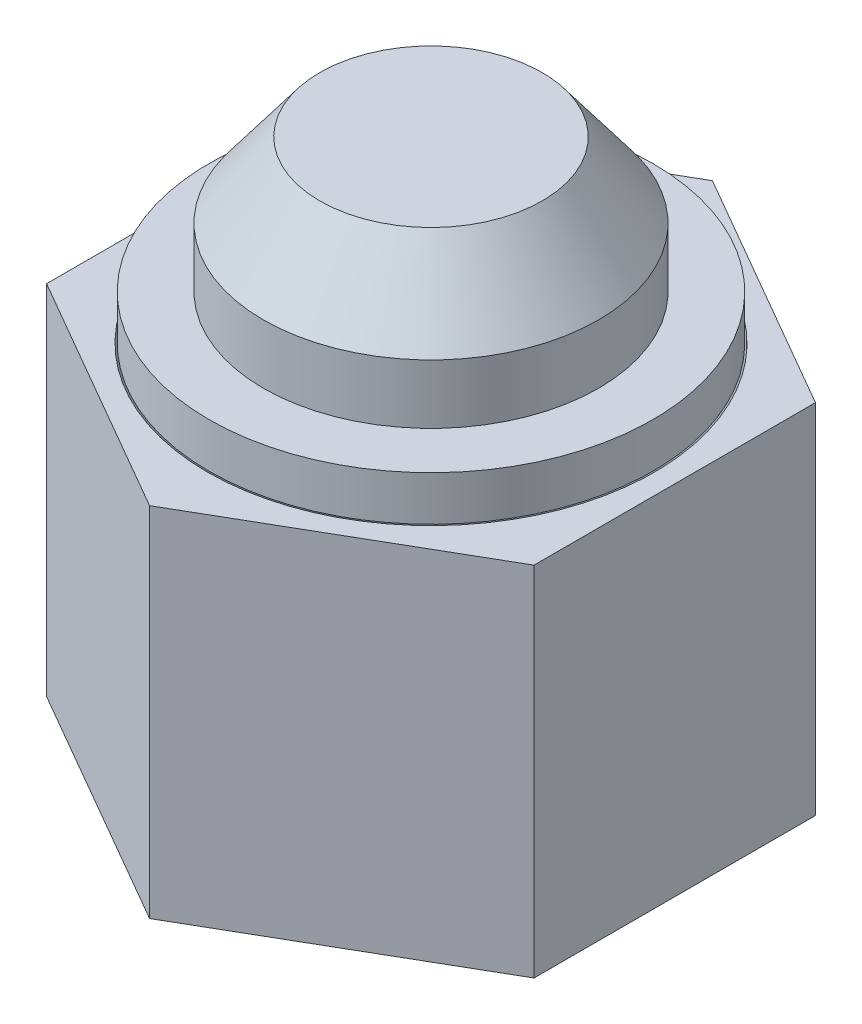
ISO-10303-21;
HEADER;
FILE_DESCRIPTION(('STEP AP214'),'2;1');
FILE_NAME('part.step','',(''),(''),'','','');
FILE_SCHEMA(('AUTOMOTIVE_DESIGN { 1 0 10303 214 1 1 1 1 }'));
ENDSEC;
DATA;
#1=APPLICATION_CONTEXT('core data for automotive mechanical design processes');
#2=APPLICATION_PROTOCOL_DEFINITION('international standard','automotive_design',2000,#1);
#3=PRODUCT_CONTEXT('',#1,'mechanical');
#4=PRODUCT('Part','Part','',(#3));
#5=PRODUCT_RELATED_PRODUCT_CATEGORY('part','',(#4));
#6=PRODUCT_DEFINITION_FORMATION('','',#4);
#7=PRODUCT_DEFINITION_CONTEXT('part definition',#1,'design');
#8=PRODUCT_DEFINITION('design','',#6,#7);
#9=PRODUCT_DEFINITION_SHAPE('','',#8);
#10=(LENGTH_UNIT() NAMED_UNIT(*) SI_UNIT(.MILLI.,.METRE.));
#11=(NAMED_UNIT(*) PLANE_ANGLE_UNIT() SI_UNIT($,.RADIAN.));
#12=(NAMED_UNIT(*) SI_UNIT($,.STERADIAN.) SOLID_ANGLE_UNIT());
#13=UNCERTAINTY_MEASURE_WITH_UNIT(LENGTH_MEASURE(1.E-05),#10,'distance_accuracy_value','');
#14=(GEOMETRIC_REPRESENTATION_CONTEXT(3) GLOBAL_UNCERTAINTY_ASSIGNED_CONTEXT((#13)) GLOBAL_UNIT_ASSIGNED_CONTEXT((#10,
#11,#12)) REPRESENTATION_CONTEXT('',''));
#15=CARTESIAN_POINT('',(0.,0.,0.));
#16=DIRECTION('',(0.,0.,1.));
#17=DIRECTION('',(1.,0.,0.));
#18=AXIS2_PLACEMENT_3D('',#15,#16,#17);
#19=CARTESIAN_POINT('',(6.92548806124741,-10.16,0.));
#20=DIRECTION('',(1.,0.,0.));
#21=DIRECTION('',(0.,0.,-1.));
#22=AXIS2_PLACEMENT_3D('',#19,#20,#21);
#23=PLANE('',#22);
#24=DIRECTION('',(0.,0.,-1.));
#25=VECTOR('',#24,1.);
#26=CARTESIAN_POINT('',(6.92548806124741,0.,0.));
#27=LINE('',#26,#25);
#28=CARTESIAN_POINT('',(6.92548806124746,0.,3.99843239643067));
#29=VERTEX_POINT('',#28);
#30=CARTESIAN_POINT('',(6.92548806124737,0.,-3.99843239643082));
#31=VERTEX_POINT('',#30);
#32=EDGE_CURVE('E153',#29,#31,#27,.T.);
#33=ORIENTED_EDGE('',*,*,#32,.F.);
#34=DIRECTION('',(0.,1.,0.));
#35=VECTOR('',#34,1.);
#36=CARTESIAN_POINT('',(6.92548806124746,-10.16,3.99843239643067));
#37=LINE('',#36,#35);
#38=CARTESIAN_POINT('',(6.92548806124746,-10.16,3.99843239643067));
#39=VERTEX_POINT('',#38);
#40=EDGE_CURVE('E12',#39,#29,#37,.T.);
#41=ORIENTED_EDGE('',*,*,#40,.F.);
#42=DIRECTION('',(0.,0.,-1.));
#43=VECTOR('',#42,1.);
#44=CARTESIAN_POINT('',(6.92548806124741,-10.16,0.));
#45=LINE('',#44,#43);
#46=CARTESIAN_POINT('',(6.92548806124737,-10.16,-3.99843239643082));
#47=VERTEX_POINT('',#46);
#48=EDGE_CURVE('E182',#39,#47,#45,.T.);
#49=ORIENTED_EDGE('',*,*,#48,.T.);
#50=DIRECTION('',(0.,1.,0.));
#51=VECTOR('',#50,1.);
#52=CARTESIAN_POINT('',(6.92548806124737,-10.16,-3.99843239643082));
#53=LINE('',#52,#51);
#54=EDGE_CURVE('E61',#47,#31,#53,.T.);
#55=ORIENTED_EDGE('',*,*,#54,.T.);
#56=EDGE_LOOP('',(#33,#41,#49,#55));
#57=FACE_BOUND('',#56,.T.);
#58=ADVANCED_FACE('F57',(#57),#23,.T.);
#59=CARTESIAN_POINT('',(3.46274403062375,-10.16,5.99764859464607));
#60=DIRECTION('',(0.500000000000007,0.,0.866025403784434));
#61=DIRECTION('',(0.866025403784435,0.,-0.500000000000007));
#62=AXIS2_PLACEMENT_3D('',#59,#60,#61);
#63=PLANE('',#62);
#64=DIRECTION('',(0.866025403784435,0.,-0.500000000000007));
#65=VECTOR('',#64,1.);
#66=CARTESIAN_POINT('',(3.46274403062375,0.,5.99764859464607));
#67=LINE('',#66,#65);
#68=CARTESIAN_POINT('',(0.,0.,7.99686479286147));
#69=VERTEX_POINT('',#68);
#70=EDGE_CURVE('E170',#69,#29,#67,.T.);
#71=ORIENTED_EDGE('',*,*,#70,.F.);
#72=DIRECTION('',(0.,1.,0.));
#73=VECTOR('',#72,1.);
#74=CARTESIAN_POINT('',(0.,-10.16,7.99686479286147));
#75=LINE('',#74,#73);
#76=CARTESIAN_POINT('',(0.,-10.16,7.99686479286147));
#77=VERTEX_POINT('',#76);
#78=EDGE_CURVE('E68',#77,#69,#75,.T.);
#79=ORIENTED_EDGE('',*,*,#78,.F.);
#80=DIRECTION('',(0.866025403784435,0.,-0.500000000000007));
#81=VECTOR('',#80,1.);
#82=CARTESIAN_POINT('',(3.46274403062375,-10.16,5.99764859464607));
#83=LINE('',#82,#81);
#84=EDGE_CURVE('E135',#77,#39,#83,.T.);
#85=ORIENTED_EDGE('',*,*,#84,.T.);
#86=ORIENTED_EDGE('',*,*,#40,.T.);
#87=EDGE_LOOP('',(#71,#79,#85,#86));
#88=FACE_BOUND('',#87,.T.);
#89=ADVANCED_FACE('F186',(#88),#63,.T.);
#90=CARTESIAN_POINT('',(-3.46274403062367,-10.16,5.99764859464612));
#91=DIRECTION('',(-0.499999999999995,0.,0.866025403784441));
#92=DIRECTION('',(0.866025403784442,0.,0.499999999999995));
#93=AXIS2_PLACEMENT_3D('',#90,#91,#92);
#94=PLANE('',#93);
#95=DIRECTION('',(0.866025403784442,0.,0.499999999999995));
#96=VECTOR('',#95,1.);
#97=CARTESIAN_POINT('',(-3.46274403062367,0.,5.99764859464612));
#98=LINE('',#97,#96);
#99=CARTESIAN_POINT('',(-6.9254880612474,0.,3.99843239643077));
#100=VERTEX_POINT('',#99);
#101=EDGE_CURVE('E121',#100,#69,#98,.T.);
#102=ORIENTED_EDGE('',*,*,#101,.F.);
#103=DIRECTION('',(0.,1.,0.));
#104=VECTOR('',#103,1.);
#105=CARTESIAN_POINT('',(-6.9254880612474,-10.16,3.99843239643077));
#106=LINE('',#105,#104);
#107=CARTESIAN_POINT('',(-6.9254880612474,-10.16,3.99843239643077));
#108=VERTEX_POINT('',#107);
#109=EDGE_CURVE('E116',#108,#100,#106,.T.);
#110=ORIENTED_EDGE('',*,*,#109,.F.);
#111=DIRECTION('',(0.866025403784442,0.,0.499999999999995));
#112=VECTOR('',#111,1.);
#113=CARTESIAN_POINT('',(-3.46274403062367,-10.16,5.99764859464612));
#114=LINE('',#113,#112);
#115=EDGE_CURVE('E119',#108,#77,#114,.T.);
#116=ORIENTED_EDGE('',*,*,#115,.T.);
#117=ORIENTED_EDGE('',*,*,#78,.T.);
#118=EDGE_LOOP('',(#102,#110,#116,#117));
#119=FACE_BOUND('',#118,.T.);
#120=ADVANCED_FACE('F118',(#119),#94,.T.);
#121=CARTESIAN_POINT('',(-6.92548806124741,-10.16,0.));
#122=DIRECTION('',(-1.,0.,0.));
#123=DIRECTION('',(0.,0.,1.));
#124=AXIS2_PLACEMENT_3D('',#121,#122,#123);
#125=PLANE('',#124);
#126=DIRECTION('',(0.,0.,1.));
#127=VECTOR('',#126,1.);
#128=CARTESIAN_POINT('',(-6.92548806124741,0.,0.));
#129=LINE('',#128,#127);
#130=CARTESIAN_POINT('',(-6.92548806124743,0.,-3.99843239643072));
#131=VERTEX_POINT('',#130);
#132=EDGE_CURVE('E165',#131,#100,#129,.T.);
#133=ORIENTED_EDGE('',*,*,#132,.F.);
#134=DIRECTION('',(0.,1.,0.));
#135=VECTOR('',#134,1.);
#136=CARTESIAN_POINT('',(-6.92548806124743,-10.16,-3.99843239643072));
#137=LINE('',#136,#135);
#138=CARTESIAN_POINT('',(-6.92548806124743,-10.16,-3.99843239643072));
#139=VERTEX_POINT('',#138);
#140=EDGE_CURVE('E127',#139,#131,#137,.T.);
#141=ORIENTED_EDGE('',*,*,#140,.F.);
#142=DIRECTION('',(0.,0.,1.));
#143=VECTOR('',#142,1.);
#144=CARTESIAN_POINT('',(-6.92548806124741,-10.16,0.));
#145=LINE('',#144,#143);
#146=EDGE_CURVE('E133',#139,#108,#145,.T.);
#147=ORIENTED_EDGE('',*,*,#146,.T.);
#148=ORIENTED_EDGE('',*,*,#109,.T.);
#149=EDGE_LOOP('',(#133,#141,#147,#148));
#150=FACE_BOUND('',#149,.T.);
#151=ADVANCED_FACE('F138',(#150),#125,.T.);
#152=CARTESIAN_POINT('',(-3.46274403062371,-10.16,-5.9976485946461));
#153=DIRECTION('',(-0.500000000000001,0.,-0.866025403784438));
#154=DIRECTION('',(-0.866025403784438,0.,0.500000000000001));
#155=AXIS2_PLACEMENT_3D('',#152,#153,#154);
#156=PLANE('',#155);
#157=DIRECTION('',(-0.866025403784438,0.,0.500000000000001));
#158=VECTOR('',#157,1.);
#159=CARTESIAN_POINT('',(-3.46274403062371,0.,-5.9976485946461));
#160=LINE('',#159,#158);
#161=CARTESIAN_POINT('',(0.,0.,-7.99686479286147));
#162=VERTEX_POINT('',#161);
#163=EDGE_CURVE('E161',#162,#131,#160,.T.);
#164=ORIENTED_EDGE('',*,*,#163,.F.);
#165=DIRECTION('',(0.,1.,0.));
#166=VECTOR('',#165,1.);
#167=CARTESIAN_POINT('',(0.,-10.16,-7.99686479286147));
#168=LINE('',#167,#166);
#169=CARTESIAN_POINT('',(0.,-10.16,-7.99686479286147));
#170=VERTEX_POINT('',#169);
#171=EDGE_CURVE('E178',#170,#162,#168,.T.);
#172=ORIENTED_EDGE('',*,*,#171,.F.);
#173=DIRECTION('',(-0.866025403784438,0.,0.500000000000001));
#174=VECTOR('',#173,1.);
#175=CARTESIAN_POINT('',(-3.46274403062371,-10.16,-5.9976485946461));
#176=LINE('',#175,#174);
#177=EDGE_CURVE('E140',#170,#139,#176,.T.);
#178=ORIENTED_EDGE('',*,*,#177,.T.);
#179=ORIENTED_EDGE('',*,*,#140,.T.);
#180=EDGE_LOOP('',(#164,#172,#178,#179));
#181=FACE_BOUND('',#180,.T.);
#182=ADVANCED_FACE('F199',(#181),#156,.T.);
#183=CARTESIAN_POINT('',(0.,-10.16,0.));
#184=DIRECTION('',(0.,1.,0.));
#185=DIRECTION('',(0.,0.,1.));
#186=AXIS2_PLACEMENT_3D('',#183,#184,#185);
#187=CYLINDRICAL_SURFACE('',#186,6.35);
#188=CARTESIAN_POINT('',(0.,-10.16,0.));
#189=DIRECTION('',(0.,1.,0.));
#190=DIRECTION('',(0.,0.,1.));
#191=AXIS2_PLACEMENT_3D('',#188,#189,#190);
#192=CIRCLE('',#191,6.35);
#193=CARTESIAN_POINT('',(0.,-10.16,6.35));
#194=VERTEX_POINT('',#193);
#195=EDGE_CURVE('E173',#194,#194,#192,.T.);
#196=ORIENTED_EDGE('',*,*,#195,.F.);
#197=EDGE_LOOP('',(#196));
#198=FACE_BOUND('',#197,.T.);
#199=CARTESIAN_POINT('',(0.,0.,0.));
#200=DIRECTION('',(0.,1.,0.));
#201=DIRECTION('',(0.,0.,1.));
#202=AXIS2_PLACEMENT_3D('',#199,#200,#201);
#203=CIRCLE('',#202,6.35);
#204=CARTESIAN_POINT('',(0.,0.,6.35));
#205=VERTEX_POINT('',#204);
#206=EDGE_CURVE('E149',#205,#205,#203,.T.);
#207=ORIENTED_EDGE('',*,*,#206,.T.);
#208=EDGE_LOOP('',(#207));
#209=FACE_BOUND('',#208,.T.);
#210=ADVANCED_FACE('F59',(#198,#209),#187,.F.);
#211=CARTESIAN_POINT('',(3.46274403062369,-10.16,-5.99764859464614));
#212=DIRECTION('',(0.499999999999995,0.,-0.866025403784441));
#213=DIRECTION('',(-0.866025403784442,0.,-0.499999999999995));
#214=AXIS2_PLACEMENT_3D('',#211,#212,#213);
#215=PLANE('',#214);
#216=DIRECTION('',(-0.866025403784441,0.,-0.499999999999995));
#217=VECTOR('',#216,1.);
#218=CARTESIAN_POINT('',(3.46274403062369,0.,-5.99764859464614));
#219=LINE('',#218,#217);
#220=EDGE_CURVE('E157',#31,#162,#219,.T.);
#221=ORIENTED_EDGE('',*,*,#220,.F.);
#222=ORIENTED_EDGE('',*,*,#54,.F.);
#223=DIRECTION('',(-0.866025403784441,0.,-0.499999999999995));
#224=VECTOR('',#223,1.);
#225=CARTESIAN_POINT('',(3.46274403062369,-10.16,-5.99764859464614));
#226=LINE('',#225,#224);
#227=EDGE_CURVE('E143',#47,#170,#226,.T.);
#228=ORIENTED_EDGE('',*,*,#227,.T.);
#229=ORIENTED_EDGE('',*,*,#171,.T.);
#230=EDGE_LOOP('',(#221,#222,#228,#229));
#231=FACE_BOUND('',#230,.T.);
#232=ADVANCED_FACE('F183',(#231),#215,.T.);
#233=CARTESIAN_POINT('',(0.,-10.16,0.));
#234=DIRECTION('',(0.,1.,0.));
#235=DIRECTION('',(0.,0.,1.));
#236=AXIS2_PLACEMENT_3D('',#233,#234,#235);
#237=PLANE('',#236);
#238=ORIENTED_EDGE('',*,*,#195,.T.);
#239=EDGE_LOOP('',(#238));
#240=FACE_BOUND('',#239,.T.);
#241=ORIENTED_EDGE('',*,*,#48,.F.);
#242=ORIENTED_EDGE('',*,*,#84,.F.);
#243=ORIENTED_EDGE('',*,*,#115,.F.);
#244=ORIENTED_EDGE('',*,*,#146,.F.);
#245=ORIENTED_EDGE('',*,*,#177,.F.);
#246=ORIENTED_EDGE('',*,*,#227,.F.);
#247=EDGE_LOOP('',(#241,#242,#243,#244,#245,#246));
#248=FACE_BOUND('',#247,.T.);
#249=ADVANCED_FACE('F131',(#240,#248),#237,.F.);
#250=CARTESIAN_POINT('',(0.,0.,0.));
#251=DIRECTION('',(0.,1.,0.));
#252=DIRECTION('',(0.,0.,1.));
#253=AXIS2_PLACEMENT_3D('',#250,#251,#252);
#254=PLANE('',#253);
#255=ORIENTED_EDGE('',*,*,#206,.F.);
#256=EDGE_LOOP('',(#255));
#257=FACE_BOUND('',#256,.T.);
#258=ORIENTED_EDGE('',*,*,#32,.T.);
#259=ORIENTED_EDGE('',*,*,#220,.T.);
#260=ORIENTED_EDGE('',*,*,#163,.T.);
#261=ORIENTED_EDGE('',*,*,#132,.T.);
#262=ORIENTED_EDGE('',*,*,#101,.T.);
#263=ORIENTED_EDGE('',*,*,#70,.T.);
#264=EDGE_LOOP('',(#258,#259,#260,#261,#262,#263));
#265=FACE_BOUND('',#264,.T.);
#266=ADVANCED_FACE('F185',(#257,#265),#254,.T.);
#267=CLOSED_SHELL('',(#58,#89,#120,#151,#182,#210,#232,#249,#266));
#268=MANIFOLD_SOLID_BREP('B2',#267);
#269=CARTESIAN_POINT('',(0.,5.08,0.));
#270=DIRECTION('',(0.,-1.,0.));
#271=DIRECTION('',(0.,0.,-1.));
#272=AXIS2_PLACEMENT_3D('',#269,#270,#271);
#273=CYLINDRICAL_SURFACE('',#272,4.7625);
#274=CARTESIAN_POINT('',(0.,2.95399993399999,0.));
#275=DIRECTION('',(0.,1.,0.));
#276=DIRECTION('',(0.,0.,1.));
#277=AXIS2_PLACEMENT_3D('',#274,#275,#276);
#278=CIRCLE('',#277,4.7625);
#279=CARTESIAN_POINT('',(0.,2.95399993399999,4.7625));
#280=VERTEX_POINT('',#279);
#281=EDGE_CURVE('E56',#280,#280,#278,.F.);
#282=ORIENTED_EDGE('',*,*,#281,.T.);
#283=EDGE_LOOP('',(#282));
#284=FACE_BOUND('',#283,.T.);
#285=CARTESIAN_POINT('',(0.,1.27,0.));
#286=DIRECTION('',(0.,1.,0.));
#287=DIRECTION('',(0.,0.,1.));
#288=AXIS2_PLACEMENT_3D('',#285,#286,#287);
#289=CIRCLE('',#288,4.7625);
#290=CARTESIAN_POINT('',(0.,1.27,4.7625));
#291=VERTEX_POINT('',#290);
#292=EDGE_CURVE('E286',#291,#291,#289,.T.);
#293=ORIENTED_EDGE('',*,*,#292,.T.);
#294=EDGE_LOOP('',(#293));
#295=FACE_BOUND('',#294,.T.);
#296=ADVANCED_FACE('F274',(#284,#295),#273,.T.);
#297=CARTESIAN_POINT('',(0.,5.08,0.));
#298=DIRECTION('',(0.,1.,0.));
#299=DIRECTION('',(0.,0.,1.));
#300=AXIS2_PLACEMENT_3D('',#297,#298,#299);
#301=PLANE('',#300);
#302=CARTESIAN_POINT('',(0.,5.08,0.));
#303=DIRECTION('',(0.,1.,0.));
#304=DIRECTION('',(0.,0.,1.));
#305=AXIS2_PLACEMENT_3D('',#302,#303,#304);
#306=CIRCLE('',#305,3.16044403974689);
#307=CARTESIAN_POINT('',(0.,5.08,3.16044403974689));
#308=VERTEX_POINT('',#307);
#309=EDGE_CURVE('E282',#308,#308,#306,.T.);
#310=ORIENTED_EDGE('',*,*,#309,.T.);
#311=EDGE_LOOP('',(#310));
#312=FACE_BOUND('',#311,.T.);
#313=ADVANCED_FACE('F304',(#312),#301,.T.);
#314=CARTESIAN_POINT('',(0.,1.27,0.));
#315=DIRECTION('',(0.,-1.,0.));
#316=DIRECTION('',(0.,0.,-1.));
#317=AXIS2_PLACEMENT_3D('',#314,#315,#316);
#318=CYLINDRICAL_SURFACE('',#317,6.30422973921278);
#319=CARTESIAN_POINT('',(0.,1.27,0.));
#320=DIRECTION('',(0.,1.,0.));
#321=DIRECTION('',(0.,0.,1.));
#322=AXIS2_PLACEMENT_3D('',#319,#320,#321);
#323=CIRCLE('',#322,6.30422973921278);
#324=CARTESIAN_POINT('',(0.,1.27,6.30422973921278));
#325=VERTEX_POINT('',#324);
#326=EDGE_CURVE('E290',#325,#325,#323,.T.);
#327=ORIENTED_EDGE('',*,*,#326,.F.);
#328=EDGE_LOOP('',(#327));
#329=FACE_BOUND('',#328,.T.);
#330=CARTESIAN_POINT('',(0.,0.,0.));
#331=DIRECTION('',(0.,1.,0.));
#332=DIRECTION('',(0.,0.,1.));
#333=AXIS2_PLACEMENT_3D('',#330,#331,#332);
#334=CIRCLE('',#333,6.30422973921278);
#335=CARTESIAN_POINT('',(0.,0.,6.30422973921278));
#336=VERTEX_POINT('',#335);
#337=EDGE_CURVE('E293',#336,#336,#334,.T.);
#338=ORIENTED_EDGE('',*,*,#337,.T.);
#339=EDGE_LOOP('',(#338));
#340=FACE_BOUND('',#339,.T.);
#341=ADVANCED_FACE('F301',(#329,#340),#318,.T.);
#342=CARTESIAN_POINT('',(0.,1.27,0.));
#343=DIRECTION('',(0.,1.,0.));
#344=DIRECTION('',(0.,0.,1.));
#345=AXIS2_PLACEMENT_3D('',#342,#343,#344);
#346=PLANE('',#345);
#347=ORIENTED_EDGE('',*,*,#292,.F.);
#348=EDGE_LOOP('',(#347));
#349=FACE_BOUND('',#348,.T.);
#350=ORIENTED_EDGE('',*,*,#326,.T.);
#351=EDGE_LOOP('',(#350));
#352=FACE_BOUND('',#351,.T.);
#353=ADVANCED_FACE('F299',(#349,#352),#346,.T.);
#354=CARTESIAN_POINT('',(0.,0.,0.));
#355=DIRECTION('',(0.,1.,0.));
#356=DIRECTION('',(0.,0.,1.));
#357=AXIS2_PLACEMENT_3D('',#354,#355,#356);
#358=PLANE('',#357);
#359=ORIENTED_EDGE('',*,*,#337,.F.);
#360=EDGE_LOOP('',(#359));
#361=FACE_BOUND('',#360,.T.);
#362=ADVANCED_FACE('F308',(#361),#358,.F.);
#363=CARTESIAN_POINT('',(0.,5.08,0.));
#364=DIRECTION('',(0.,-1.,0.));
#365=DIRECTION('',(0.,0.,-1.));
#366=AXIS2_PLACEMENT_3D('',#363,#364,#365);
#367=CONICAL_SURFACE('',#366,3.16044403974689,0.6457718232379);
#368=ORIENTED_EDGE('',*,*,#281,.F.);
#369=EDGE_LOOP('',(#368));
#370=FACE_BOUND('',#369,.T.);
#371=ORIENTED_EDGE('',*,*,#309,.F.);
#372=EDGE_LOOP('',(#371));
#373=FACE_BOUND('',#372,.T.);
#374=ADVANCED_FACE('F277',(#370,#373),#367,.T.);
#375=CLOSED_SHELL('',(#296,#313,#341,#353,#362,#374));
#376=MANIFOLD_SOLID_BREP('B6',#375);
#377=ADVANCED_BREP_SHAPE_REPRESENTATION('',(#18,#268,#376),#14);
#378=SHAPE_DEFINITION_REPRESENTATION(#9,#377);
ENDSEC;
END-ISO-10303-21;
